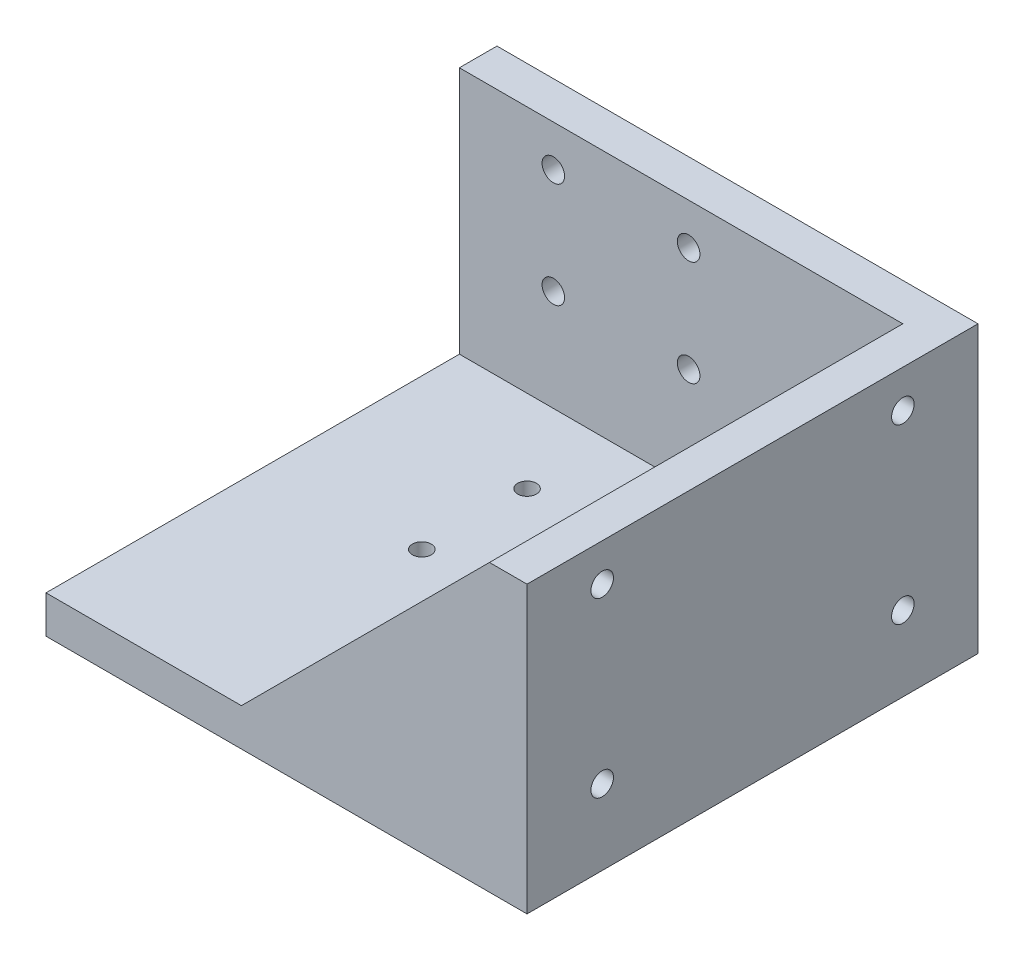
ISO-10303-21;
HEADER;
FILE_DESCRIPTION(('STEP AP214'),'2;1');
FILE_NAME('part.step','',(''),(''),'','','');
FILE_SCHEMA(('AUTOMOTIVE_DESIGN { 1 0 10303 214 1 1 1 1 }'));
ENDSEC;
DATA;
#1=APPLICATION_CONTEXT('core data for automotive mechanical design processes');
#2=APPLICATION_PROTOCOL_DEFINITION('international standard','automotive_design',2000,#1);
#3=PRODUCT_CONTEXT('',#1,'mechanical');
#4=PRODUCT('Part','Part','',(#3));
#5=PRODUCT_RELATED_PRODUCT_CATEGORY('part','',(#4));
#6=PRODUCT_DEFINITION_FORMATION('','',#4);
#7=PRODUCT_DEFINITION_CONTEXT('part definition',#1,'design');
#8=PRODUCT_DEFINITION('design','',#6,#7);
#9=PRODUCT_DEFINITION_SHAPE('','',#8);
#10=(LENGTH_UNIT() NAMED_UNIT(*) SI_UNIT(.MILLI.,.METRE.));
#11=(NAMED_UNIT(*) PLANE_ANGLE_UNIT() SI_UNIT($,.RADIAN.));
#12=(NAMED_UNIT(*) SI_UNIT($,.STERADIAN.) SOLID_ANGLE_UNIT());
#13=UNCERTAINTY_MEASURE_WITH_UNIT(LENGTH_MEASURE(1.E-05),#10,'distance_accuracy_value','');
#14=(GEOMETRIC_REPRESENTATION_CONTEXT(3) GLOBAL_UNCERTAINTY_ASSIGNED_CONTEXT((#13)) GLOBAL_UNIT_ASSIGNED_CONTEXT((#10,
#11,#12)) REPRESENTATION_CONTEXT('',''));
#15=CARTESIAN_POINT('',(0.,0.,0.));
#16=DIRECTION('',(0.,0.,1.));
#17=DIRECTION('',(1.,0.,0.));
#18=AXIS2_PLACEMENT_3D('',#15,#16,#17);
#19=CARTESIAN_POINT('',(0.,5.,0.));
#20=DIRECTION('',(0.,1.,0.));
#21=DIRECTION('',(0.,0.,1.));
#22=AXIS2_PLACEMENT_3D('',#19,#20,#21);
#23=PLANE('',#22);
#24=CARTESIAN_POINT('',(-12.,5.,-4.));
#25=DIRECTION('',(0.,1.,0.));
#26=DIRECTION('',(0.,0.,1.));
#27=AXIS2_PLACEMENT_3D('',#24,#25,#26);
#28=CIRCLE('',#27,1.25);
#29=CARTESIAN_POINT('',(-12.,5.,-2.75));
#30=VERTEX_POINT('',#29);
#31=EDGE_CURVE('E155',#30,#30,#28,.T.);
#32=ORIENTED_EDGE('',*,*,#31,.F.);
#33=EDGE_LOOP('',(#32));
#34=FACE_BOUND('',#33,.T.);
#35=CARTESIAN_POINT('',(-12.,5.,10.));
#36=DIRECTION('',(0.,1.,0.));
#37=DIRECTION('',(0.,0.,1.));
#38=AXIS2_PLACEMENT_3D('',#35,#36,#37);
#39=CIRCLE('',#38,1.25);
#40=CARTESIAN_POINT('',(-12.,5.,11.25));
#41=VERTEX_POINT('',#40);
#42=EDGE_CURVE('E161',#41,#41,#39,.T.);
#43=ORIENTED_EDGE('',*,*,#42,.F.);
#44=EDGE_LOOP('',(#43));
#45=FACE_BOUND('',#44,.T.);
#46=DIRECTION('',(0.,0.,1.));
#47=VECTOR('',#46,1.);
#48=CARTESIAN_POINT('',(-6.00000000000001,5.,35.));
#49=LINE('',#48,#47);
#50=CARTESIAN_POINT('',(-6.00000000000001,5.,35.));
#51=VERTEX_POINT('',#50);
#52=CARTESIAN_POINT('',(-6.00000000000001,5.,40.));
#53=VERTEX_POINT('',#52);
#54=EDGE_CURVE('E69',#51,#53,#49,.T.);
#55=ORIENTED_EDGE('',*,*,#54,.F.);
#56=DIRECTION('',(-1.,0.,0.));
#57=VECTOR('',#56,1.);
#58=CARTESIAN_POINT('',(-6.00000000000001,5.,35.));
#59=LINE('',#58,#57);
#60=CARTESIAN_POINT('',(27.,5.,35.));
#61=VERTEX_POINT('',#60);
#62=EDGE_CURVE('E119',#61,#51,#59,.T.);
#63=ORIENTED_EDGE('',*,*,#62,.F.);
#64=DIRECTION('',(0.,0.,-1.));
#65=VECTOR('',#64,1.);
#66=CARTESIAN_POINT('',(27.,5.,40.));
#67=LINE('',#66,#65);
#68=CARTESIAN_POINT('',(27.,5.,-15.));
#69=VERTEX_POINT('',#68);
#70=EDGE_CURVE('E132',#61,#69,#67,.T.);
#71=ORIENTED_EDGE('',*,*,#70,.T.);
#72=DIRECTION('',(1.,0.,0.));
#73=VECTOR('',#72,1.);
#74=CARTESIAN_POINT('',(-32.,5.,-15.));
#75=LINE('',#74,#73);
#76=CARTESIAN_POINT('',(-32.,5.,-15.));
#77=VERTEX_POINT('',#76);
#78=EDGE_CURVE('E173',#77,#69,#75,.T.);
#79=ORIENTED_EDGE('',*,*,#78,.F.);
#80=DIRECTION('',(0.,0.,1.));
#81=VECTOR('',#80,1.);
#82=CARTESIAN_POINT('',(-32.,5.,-20.));
#83=LINE('',#82,#81);
#84=CARTESIAN_POINT('',(-32.,4.99999999999999,40.));
#85=VERTEX_POINT('',#84);
#86=EDGE_CURVE('E147',#77,#85,#83,.T.);
#87=ORIENTED_EDGE('',*,*,#86,.T.);
#88=DIRECTION('',(-1.,0.,0.));
#89=VECTOR('',#88,1.);
#90=CARTESIAN_POINT('',(32.,5.,40.));
#91=LINE('',#90,#89);
#92=EDGE_CURVE('E214',#53,#85,#91,.T.);
#93=ORIENTED_EDGE('',*,*,#92,.F.);
#94=EDGE_LOOP('',(#55,#63,#71,#79,#87,#93));
#95=FACE_BOUND('',#94,.T.);
#96=ADVANCED_FACE('F47',(#34,#45,#95),#23,.T.);
#97=CARTESIAN_POINT('',(27.,38.,40.));
#98=DIRECTION('',(1.,0.,0.));
#99=DIRECTION('',(0.,0.,-1.));
#100=AXIS2_PLACEMENT_3D('',#97,#98,#99);
#101=PLANE('',#100);
#102=CARTESIAN_POINT('',(27.,10.,-10.));
#103=DIRECTION('',(-1.,0.,0.));
#104=DIRECTION('',(0.,0.,1.));
#105=AXIS2_PLACEMENT_3D('',#102,#103,#104);
#106=CIRCLE('',#105,1.5);
#107=CARTESIAN_POINT('',(27.,10.,-8.5));
#108=VERTEX_POINT('',#107);
#109=EDGE_CURVE('E231',#108,#108,#106,.T.);
#110=ORIENTED_EDGE('',*,*,#109,.F.);
#111=EDGE_LOOP('',(#110));
#112=FACE_BOUND('',#111,.T.);
#113=CARTESIAN_POINT('',(27.,33.,30.));
#114=DIRECTION('',(-1.,0.,0.));
#115=DIRECTION('',(0.,0.,1.));
#116=AXIS2_PLACEMENT_3D('',#113,#114,#115);
#117=CIRCLE('',#116,1.5);
#118=CARTESIAN_POINT('',(27.,33.,31.5));
#119=VERTEX_POINT('',#118);
#120=EDGE_CURVE('E238',#119,#119,#117,.T.);
#121=ORIENTED_EDGE('',*,*,#120,.F.);
#122=EDGE_LOOP('',(#121));
#123=FACE_BOUND('',#122,.T.);
#124=CARTESIAN_POINT('',(27.,10.,30.));
#125=DIRECTION('',(-1.,0.,0.));
#126=DIRECTION('',(0.,0.,1.));
#127=AXIS2_PLACEMENT_3D('',#124,#125,#126);
#128=CIRCLE('',#127,1.50000000000001);
#129=CARTESIAN_POINT('',(27.,10.,31.5));
#130=VERTEX_POINT('',#129);
#131=EDGE_CURVE('E230',#130,#130,#128,.T.);
#132=ORIENTED_EDGE('',*,*,#131,.F.);
#133=EDGE_LOOP('',(#132));
#134=FACE_BOUND('',#133,.T.);
#135=CARTESIAN_POINT('',(27.,33.,-10.));
#136=DIRECTION('',(-1.,0.,0.));
#137=DIRECTION('',(0.,0.,1.));
#138=AXIS2_PLACEMENT_3D('',#135,#136,#137);
#139=CIRCLE('',#138,1.5);
#140=CARTESIAN_POINT('',(27.,33.,-8.5));
#141=VERTEX_POINT('',#140);
#142=EDGE_CURVE('E227',#141,#141,#139,.T.);
#143=ORIENTED_EDGE('',*,*,#142,.F.);
#144=EDGE_LOOP('',(#143));
#145=FACE_BOUND('',#144,.T.);
#146=DIRECTION('',(0.,-1.,0.));
#147=VECTOR('',#146,1.);
#148=CARTESIAN_POINT('',(27.,38.,35.));
#149=LINE('',#148,#147);
#150=CARTESIAN_POINT('',(27.,38.,35.));
#151=VERTEX_POINT('',#150);
#152=EDGE_CURVE('E118',#151,#61,#149,.T.);
#153=ORIENTED_EDGE('',*,*,#152,.F.);
#154=DIRECTION('',(0.,0.,-1.));
#155=VECTOR('',#154,1.);
#156=CARTESIAN_POINT('',(27.,38.,40.));
#157=LINE('',#156,#155);
#158=CARTESIAN_POINT('',(27.,38.,-15.));
#159=VERTEX_POINT('',#158);
#160=EDGE_CURVE('E122',#151,#159,#157,.T.);
#161=ORIENTED_EDGE('',*,*,#160,.T.);
#162=DIRECTION('',(0.,-1.,0.));
#163=VECTOR('',#162,1.);
#164=CARTESIAN_POINT('',(27.,38.,-15.));
#165=LINE('',#164,#163);
#166=EDGE_CURVE('E137',#159,#69,#165,.T.);
#167=ORIENTED_EDGE('',*,*,#166,.T.);
#168=ORIENTED_EDGE('',*,*,#70,.F.);
#169=EDGE_LOOP('',(#153,#161,#167,#168));
#170=FACE_BOUND('',#169,.T.);
#171=ADVANCED_FACE('F136',(#112,#123,#134,#145,#170),#101,.F.);
#172=CARTESIAN_POINT('',(-32.,38.,-15.));
#173=DIRECTION('',(0.,0.,-1.));
#174=DIRECTION('',(-1.,0.,0.));
#175=AXIS2_PLACEMENT_3D('',#172,#173,#174);
#176=PLANE('',#175);
#177=CARTESIAN_POINT('',(-19.5,18.5,-15.));
#178=DIRECTION('',(0.,0.,-1.));
#179=DIRECTION('',(-1.,0.,0.));
#180=AXIS2_PLACEMENT_3D('',#177,#178,#179);
#181=CIRCLE('',#180,1.5);
#182=CARTESIAN_POINT('',(-21.,18.5,-15.));
#183=VERTEX_POINT('',#182);
#184=EDGE_CURVE('E177',#183,#183,#181,.F.);
#185=ORIENTED_EDGE('',*,*,#184,.F.);
#186=EDGE_LOOP('',(#185));
#187=FACE_BOUND('',#186,.T.);
#188=CARTESIAN_POINT('',(-19.5,32.5,-15.));
#189=DIRECTION('',(0.,0.,-1.));
#190=DIRECTION('',(-1.,0.,0.));
#191=AXIS2_PLACEMENT_3D('',#188,#189,#190);
#192=CIRCLE('',#191,1.5);
#193=CARTESIAN_POINT('',(-21.,32.5,-15.));
#194=VERTEX_POINT('',#193);
#195=EDGE_CURVE('E202',#194,#194,#192,.F.);
#196=ORIENTED_EDGE('',*,*,#195,.F.);
#197=EDGE_LOOP('',(#196));
#198=FACE_BOUND('',#197,.T.);
#199=CARTESIAN_POINT('',(-1.5,32.5,-15.));
#200=DIRECTION('',(0.,0.,-1.));
#201=DIRECTION('',(-1.,0.,0.));
#202=AXIS2_PLACEMENT_3D('',#199,#200,#201);
#203=CIRCLE('',#202,1.5);
#204=CARTESIAN_POINT('',(-3.,32.5,-15.));
#205=VERTEX_POINT('',#204);
#206=EDGE_CURVE('E194',#205,#205,#203,.F.);
#207=ORIENTED_EDGE('',*,*,#206,.F.);
#208=EDGE_LOOP('',(#207));
#209=FACE_BOUND('',#208,.T.);
#210=CARTESIAN_POINT('',(-1.5,18.5,-15.));
#211=DIRECTION('',(0.,0.,-1.));
#212=DIRECTION('',(-1.,0.,0.));
#213=AXIS2_PLACEMENT_3D('',#210,#211,#212);
#214=CIRCLE('',#213,1.5);
#215=CARTESIAN_POINT('',(-3.,18.5,-15.));
#216=VERTEX_POINT('',#215);
#217=EDGE_CURVE('E195',#216,#216,#214,.F.);
#218=ORIENTED_EDGE('',*,*,#217,.F.);
#219=EDGE_LOOP('',(#218));
#220=FACE_BOUND('',#219,.T.);
#221=ORIENTED_EDGE('',*,*,#166,.F.);
#222=DIRECTION('',(1.,0.,0.));
#223=VECTOR('',#222,1.);
#224=CARTESIAN_POINT('',(-32.,38.,-15.));
#225=LINE('',#224,#223);
#226=CARTESIAN_POINT('',(-32.,38.,-15.));
#227=VERTEX_POINT('',#226);
#228=EDGE_CURVE('E128',#227,#159,#225,.T.);
#229=ORIENTED_EDGE('',*,*,#228,.F.);
#230=DIRECTION('',(0.,-1.,0.));
#231=VECTOR('',#230,1.);
#232=CARTESIAN_POINT('',(-32.,38.,-15.));
#233=LINE('',#232,#231);
#234=EDGE_CURVE('E167',#227,#77,#233,.T.);
#235=ORIENTED_EDGE('',*,*,#234,.T.);
#236=ORIENTED_EDGE('',*,*,#78,.T.);
#237=EDGE_LOOP('',(#221,#229,#235,#236));
#238=FACE_BOUND('',#237,.T.);
#239=ADVANCED_FACE('F275',(#187,#198,#209,#220,#238),#176,.F.);
#240=CARTESIAN_POINT('',(0.,0.,0.));
#241=DIRECTION('',(0.,1.,0.));
#242=DIRECTION('',(0.,0.,1.));
#243=AXIS2_PLACEMENT_3D('',#240,#241,#242);
#244=PLANE('',#243);
#245=DIRECTION('',(0.,0.,-1.));
#246=VECTOR('',#245,1.);
#247=CARTESIAN_POINT('',(32.,0.,-20.));
#248=LINE('',#247,#246);
#249=CARTESIAN_POINT('',(32.,0.,40.));
#250=VERTEX_POINT('',#249);
#251=CARTESIAN_POINT('',(32.,0.,-20.));
#252=VERTEX_POINT('',#251);
#253=EDGE_CURVE('E152',#250,#252,#248,.T.);
#254=ORIENTED_EDGE('',*,*,#253,.F.);
#255=DIRECTION('',(1.,0.,0.));
#256=VECTOR('',#255,1.);
#257=CARTESIAN_POINT('',(32.,0.,40.));
#258=LINE('',#257,#256);
#259=CARTESIAN_POINT('',(-32.,0.,40.));
#260=VERTEX_POINT('',#259);
#261=EDGE_CURVE('E198',#260,#250,#258,.T.);
#262=ORIENTED_EDGE('',*,*,#261,.F.);
#263=DIRECTION('',(0.,0.,1.));
#264=VECTOR('',#263,1.);
#265=CARTESIAN_POINT('',(-32.,0.,-20.));
#266=LINE('',#265,#264);
#267=CARTESIAN_POINT('',(-32.,0.,-20.));
#268=VERTEX_POINT('',#267);
#269=EDGE_CURVE('E148',#268,#260,#266,.T.);
#270=ORIENTED_EDGE('',*,*,#269,.F.);
#271=DIRECTION('',(-1.,0.,0.));
#272=VECTOR('',#271,1.);
#273=CARTESIAN_POINT('',(-32.,0.,-20.));
#274=LINE('',#273,#272);
#275=EDGE_CURVE('E150',#252,#268,#274,.T.);
#276=ORIENTED_EDGE('',*,*,#275,.F.);
#277=EDGE_LOOP('',(#254,#262,#270,#276));
#278=FACE_BOUND('',#277,.T.);
#279=CARTESIAN_POINT('',(-12.,0.,-4.));
#280=DIRECTION('',(0.,1.,0.));
#281=DIRECTION('',(0.,0.,1.));
#282=AXIS2_PLACEMENT_3D('',#279,#280,#281);
#283=CIRCLE('',#282,1.25);
#284=CARTESIAN_POINT('',(-12.,0.,-2.75));
#285=VERTEX_POINT('',#284);
#286=EDGE_CURVE('E158',#285,#285,#283,.T.);
#287=ORIENTED_EDGE('',*,*,#286,.T.);
#288=EDGE_LOOP('',(#287));
#289=FACE_BOUND('',#288,.T.);
#290=CARTESIAN_POINT('',(-12.,0.,10.));
#291=DIRECTION('',(0.,1.,0.));
#292=DIRECTION('',(0.,0.,1.));
#293=AXIS2_PLACEMENT_3D('',#290,#291,#292);
#294=CIRCLE('',#293,1.25);
#295=CARTESIAN_POINT('',(-12.,0.,11.25));
#296=VERTEX_POINT('',#295);
#297=EDGE_CURVE('E164',#296,#296,#294,.T.);
#298=ORIENTED_EDGE('',*,*,#297,.T.);
#299=EDGE_LOOP('',(#298));
#300=FACE_BOUND('',#299,.T.);
#301=ADVANCED_FACE('F255',(#278,#289,#300),#244,.F.);
#302=CARTESIAN_POINT('',(32.,5.,-20.));
#303=DIRECTION('',(-1.,0.,0.));
#304=DIRECTION('',(0.,0.,1.));
#305=AXIS2_PLACEMENT_3D('',#302,#303,#304);
#306=PLANE('',#305);
#307=CARTESIAN_POINT('',(32.,10.,-10.));
#308=DIRECTION('',(-1.,0.,0.));
#309=DIRECTION('',(0.,0.,1.));
#310=AXIS2_PLACEMENT_3D('',#307,#308,#309);
#311=CIRCLE('',#310,1.5);
#312=CARTESIAN_POINT('',(32.,10.,-8.5));
#313=VERTEX_POINT('',#312);
#314=EDGE_CURVE('E235',#313,#313,#311,.F.);
#315=ORIENTED_EDGE('',*,*,#314,.F.);
#316=EDGE_LOOP('',(#315));
#317=FACE_BOUND('',#316,.T.);
#318=CARTESIAN_POINT('',(32.,33.,30.));
#319=DIRECTION('',(-1.,0.,0.));
#320=DIRECTION('',(0.,0.,1.));
#321=AXIS2_PLACEMENT_3D('',#318,#319,#320);
#322=CIRCLE('',#321,1.5);
#323=CARTESIAN_POINT('',(32.,33.,31.5));
#324=VERTEX_POINT('',#323);
#325=EDGE_CURVE('E234',#324,#324,#322,.F.);
#326=ORIENTED_EDGE('',*,*,#325,.F.);
#327=EDGE_LOOP('',(#326));
#328=FACE_BOUND('',#327,.T.);
#329=CARTESIAN_POINT('',(32.,10.,30.));
#330=DIRECTION('',(-1.,0.,0.));
#331=DIRECTION('',(0.,0.,1.));
#332=AXIS2_PLACEMENT_3D('',#329,#330,#331);
#333=CIRCLE('',#332,1.50000000000001);
#334=CARTESIAN_POINT('',(32.,10.,31.5));
#335=VERTEX_POINT('',#334);
#336=EDGE_CURVE('E241',#335,#335,#333,.F.);
#337=ORIENTED_EDGE('',*,*,#336,.F.);
#338=EDGE_LOOP('',(#337));
#339=FACE_BOUND('',#338,.T.);
#340=CARTESIAN_POINT('',(32.,33.,-10.));
#341=DIRECTION('',(-1.,0.,0.));
#342=DIRECTION('',(0.,0.,1.));
#343=AXIS2_PLACEMENT_3D('',#340,#341,#342);
#344=CIRCLE('',#343,1.5);
#345=CARTESIAN_POINT('',(32.,33.,-8.5));
#346=VERTEX_POINT('',#345);
#347=EDGE_CURVE('E224',#346,#346,#344,.F.);
#348=ORIENTED_EDGE('',*,*,#347,.F.);
#349=EDGE_LOOP('',(#348));
#350=FACE_BOUND('',#349,.T.);
#351=ORIENTED_EDGE('',*,*,#253,.T.);
#352=DIRECTION('',(0.,-1.,0.));
#353=VECTOR('',#352,1.);
#354=CARTESIAN_POINT('',(32.,5.,-20.));
#355=LINE('',#354,#353);
#356=CARTESIAN_POINT('',(32.,38.,-20.));
#357=VERTEX_POINT('',#356);
#358=EDGE_CURVE('E139',#357,#252,#355,.T.);
#359=ORIENTED_EDGE('',*,*,#358,.F.);
#360=DIRECTION('',(0.,0.,-1.));
#361=VECTOR('',#360,1.);
#362=CARTESIAN_POINT('',(32.,38.,-20.));
#363=LINE('',#362,#361);
#364=CARTESIAN_POINT('',(32.,38.,40.));
#365=VERTEX_POINT('',#364);
#366=EDGE_CURVE('E180',#365,#357,#363,.T.);
#367=ORIENTED_EDGE('',*,*,#366,.F.);
#368=DIRECTION('',(0.,1.,0.));
#369=VECTOR('',#368,1.);
#370=CARTESIAN_POINT('',(32.,5.,40.));
#371=LINE('',#370,#369);
#372=EDGE_CURVE('E216',#250,#365,#371,.T.);
#373=ORIENTED_EDGE('',*,*,#372,.F.);
#374=EDGE_LOOP('',(#351,#359,#367,#373));
#375=FACE_BOUND('',#374,.T.);
#376=ADVANCED_FACE('F251',(#317,#328,#339,#350,#375),#306,.F.);
#377=CARTESIAN_POINT('',(-32.,5.,-20.));
#378=DIRECTION('',(0.,0.,1.));
#379=DIRECTION('',(1.,0.,0.));
#380=AXIS2_PLACEMENT_3D('',#377,#378,#379);
#381=PLANE('',#380);
#382=CARTESIAN_POINT('',(-1.5,18.5,-20.));
#383=DIRECTION('',(0.,0.,-1.));
#384=DIRECTION('',(-1.,0.,0.));
#385=AXIS2_PLACEMENT_3D('',#382,#383,#384);
#386=CIRCLE('',#385,1.5);
#387=CARTESIAN_POINT('',(-3.,18.5,-20.));
#388=VERTEX_POINT('',#387);
#389=EDGE_CURVE('E191',#388,#388,#386,.T.);
#390=ORIENTED_EDGE('',*,*,#389,.F.);
#391=EDGE_LOOP('',(#390));
#392=FACE_BOUND('',#391,.T.);
#393=CARTESIAN_POINT('',(-1.5,32.5,-20.));
#394=DIRECTION('',(0.,0.,-1.));
#395=DIRECTION('',(-1.,0.,0.));
#396=AXIS2_PLACEMENT_3D('',#393,#394,#395);
#397=CIRCLE('',#396,1.5);
#398=CARTESIAN_POINT('',(-3.,32.5,-20.));
#399=VERTEX_POINT('',#398);
#400=EDGE_CURVE('E199',#399,#399,#397,.T.);
#401=ORIENTED_EDGE('',*,*,#400,.F.);
#402=EDGE_LOOP('',(#401));
#403=FACE_BOUND('',#402,.T.);
#404=CARTESIAN_POINT('',(-19.5,32.5,-20.));
#405=DIRECTION('',(0.,0.,-1.));
#406=DIRECTION('',(-1.,0.,0.));
#407=AXIS2_PLACEMENT_3D('',#404,#405,#406);
#408=CIRCLE('',#407,1.5);
#409=CARTESIAN_POINT('',(-21.,32.5,-20.));
#410=VERTEX_POINT('',#409);
#411=EDGE_CURVE('E190',#410,#410,#408,.T.);
#412=ORIENTED_EDGE('',*,*,#411,.F.);
#413=EDGE_LOOP('',(#412));
#414=FACE_BOUND('',#413,.T.);
#415=CARTESIAN_POINT('',(-19.5,18.5,-20.));
#416=DIRECTION('',(0.,0.,-1.));
#417=DIRECTION('',(-1.,0.,0.));
#418=AXIS2_PLACEMENT_3D('',#415,#416,#417);
#419=CIRCLE('',#418,1.5);
#420=CARTESIAN_POINT('',(-21.,18.5,-20.));
#421=VERTEX_POINT('',#420);
#422=EDGE_CURVE('E187',#421,#421,#419,.T.);
#423=ORIENTED_EDGE('',*,*,#422,.F.);
#424=EDGE_LOOP('',(#423));
#425=FACE_BOUND('',#424,.T.);
#426=ORIENTED_EDGE('',*,*,#275,.T.);
#427=DIRECTION('',(0.,-1.,0.));
#428=VECTOR('',#427,1.);
#429=CARTESIAN_POINT('',(-32.,5.,-20.));
#430=LINE('',#429,#428);
#431=CARTESIAN_POINT('',(-32.,38.,-20.));
#432=VERTEX_POINT('',#431);
#433=EDGE_CURVE('E142',#432,#268,#430,.T.);
#434=ORIENTED_EDGE('',*,*,#433,.F.);
#435=DIRECTION('',(-1.,0.,0.));
#436=VECTOR('',#435,1.);
#437=CARTESIAN_POINT('',(-32.,38.,-20.));
#438=LINE('',#437,#436);
#439=EDGE_CURVE('E172',#357,#432,#438,.T.);
#440=ORIENTED_EDGE('',*,*,#439,.F.);
#441=ORIENTED_EDGE('',*,*,#358,.T.);
#442=EDGE_LOOP('',(#426,#434,#440,#441));
#443=FACE_BOUND('',#442,.T.);
#444=ADVANCED_FACE('F254',(#392,#403,#414,#425,#443),#381,.F.);
#445=CARTESIAN_POINT('',(-32.,5.,-20.));
#446=DIRECTION('',(1.,0.,0.));
#447=DIRECTION('',(0.,0.,-1.));
#448=AXIS2_PLACEMENT_3D('',#445,#446,#447);
#449=PLANE('',#448);
#450=ORIENTED_EDGE('',*,*,#269,.T.);
#451=DIRECTION('',(0.,-1.,0.));
#452=VECTOR('',#451,1.);
#453=CARTESIAN_POINT('',(-32.,4.99999999999999,40.));
#454=LINE('',#453,#452);
#455=EDGE_CURVE('E211',#85,#260,#454,.T.);
#456=ORIENTED_EDGE('',*,*,#455,.F.);
#457=ORIENTED_EDGE('',*,*,#86,.F.);
#458=ORIENTED_EDGE('',*,*,#234,.F.);
#459=DIRECTION('',(0.,0.,1.));
#460=VECTOR('',#459,1.);
#461=CARTESIAN_POINT('',(-32.,38.,-20.));
#462=LINE('',#461,#460);
#463=EDGE_CURVE('E176',#432,#227,#462,.T.);
#464=ORIENTED_EDGE('',*,*,#463,.F.);
#465=ORIENTED_EDGE('',*,*,#433,.T.);
#466=EDGE_LOOP('',(#450,#456,#457,#458,#464,#465));
#467=FACE_BOUND('',#466,.T.);
#468=ADVANCED_FACE('F269',(#467),#449,.F.);
#469=CARTESIAN_POINT('',(-12.,5.,-4.));
#470=DIRECTION('',(0.,-1.,0.));
#471=DIRECTION('',(0.,0.,-1.));
#472=AXIS2_PLACEMENT_3D('',#469,#470,#471);
#473=CYLINDRICAL_SURFACE('',#472,1.25);
#474=ORIENTED_EDGE('',*,*,#31,.T.);
#475=EDGE_LOOP('',(#474));
#476=FACE_BOUND('',#475,.T.);
#477=ORIENTED_EDGE('',*,*,#286,.F.);
#478=EDGE_LOOP('',(#477));
#479=FACE_BOUND('',#478,.T.);
#480=ADVANCED_FACE('F300',(#476,#479),#473,.F.);
#481=CARTESIAN_POINT('',(-12.,5.,10.));
#482=DIRECTION('',(0.,-1.,0.));
#483=DIRECTION('',(0.,0.,-1.));
#484=AXIS2_PLACEMENT_3D('',#481,#482,#483);
#485=CYLINDRICAL_SURFACE('',#484,1.25);
#486=ORIENTED_EDGE('',*,*,#42,.T.);
#487=EDGE_LOOP('',(#486));
#488=FACE_BOUND('',#487,.T.);
#489=ORIENTED_EDGE('',*,*,#297,.F.);
#490=EDGE_LOOP('',(#489));
#491=FACE_BOUND('',#490,.T.);
#492=ADVANCED_FACE('F327',(#488,#491),#485,.F.);
#493=CARTESIAN_POINT('',(0.,38.,0.));
#494=DIRECTION('',(0.,1.,0.));
#495=DIRECTION('',(0.,0.,1.));
#496=AXIS2_PLACEMENT_3D('',#493,#494,#495);
#497=PLANE('',#496);
#498=ORIENTED_EDGE('',*,*,#160,.F.);
#499=DIRECTION('',(0.,0.,1.));
#500=VECTOR('',#499,1.);
#501=CARTESIAN_POINT('',(27.,38.,40.));
#502=LINE('',#501,#500);
#503=CARTESIAN_POINT('',(27.,38.,40.));
#504=VERTEX_POINT('',#503);
#505=EDGE_CURVE('E125',#151,#504,#502,.T.);
#506=ORIENTED_EDGE('',*,*,#505,.T.);
#507=DIRECTION('',(-1.,0.,0.));
#508=VECTOR('',#507,1.);
#509=CARTESIAN_POINT('',(27.,38.,40.));
#510=LINE('',#509,#508);
#511=EDGE_CURVE('E133',#365,#504,#510,.T.);
#512=ORIENTED_EDGE('',*,*,#511,.F.);
#513=ORIENTED_EDGE('',*,*,#366,.T.);
#514=ORIENTED_EDGE('',*,*,#439,.T.);
#515=ORIENTED_EDGE('',*,*,#463,.T.);
#516=ORIENTED_EDGE('',*,*,#228,.T.);
#517=EDGE_LOOP('',(#498,#506,#512,#513,#514,#515,#516));
#518=FACE_BOUND('',#517,.T.);
#519=ADVANCED_FACE('F123',(#518),#497,.T.);
#520=CARTESIAN_POINT('',(-19.5,18.5,20.001));
#521=DIRECTION('',(0.,0.,-1.));
#522=DIRECTION('',(-1.,0.,0.));
#523=AXIS2_PLACEMENT_3D('',#520,#521,#522);
#524=CYLINDRICAL_SURFACE('',#523,1.5);
#525=ORIENTED_EDGE('',*,*,#422,.T.);
#526=EDGE_LOOP('',(#525));
#527=FACE_BOUND('',#526,.T.);
#528=ORIENTED_EDGE('',*,*,#184,.T.);
#529=EDGE_LOOP('',(#528));
#530=FACE_BOUND('',#529,.T.);
#531=ADVANCED_FACE('F317',(#527,#530),#524,.F.);
#532=CARTESIAN_POINT('',(-19.5,32.5,20.001));
#533=DIRECTION('',(0.,0.,-1.));
#534=DIRECTION('',(-1.,0.,0.));
#535=AXIS2_PLACEMENT_3D('',#532,#533,#534);
#536=CYLINDRICAL_SURFACE('',#535,1.5);
#537=ORIENTED_EDGE('',*,*,#411,.T.);
#538=EDGE_LOOP('',(#537));
#539=FACE_BOUND('',#538,.T.);
#540=ORIENTED_EDGE('',*,*,#195,.T.);
#541=EDGE_LOOP('',(#540));
#542=FACE_BOUND('',#541,.T.);
#543=ADVANCED_FACE('F319',(#539,#542),#536,.F.);
#544=CARTESIAN_POINT('',(-1.5,32.5,20.001));
#545=DIRECTION('',(0.,0.,-1.));
#546=DIRECTION('',(-1.,0.,0.));
#547=AXIS2_PLACEMENT_3D('',#544,#545,#546);
#548=CYLINDRICAL_SURFACE('',#547,1.5);
#549=ORIENTED_EDGE('',*,*,#400,.T.);
#550=EDGE_LOOP('',(#549));
#551=FACE_BOUND('',#550,.T.);
#552=ORIENTED_EDGE('',*,*,#206,.T.);
#553=EDGE_LOOP('',(#552));
#554=FACE_BOUND('',#553,.T.);
#555=ADVANCED_FACE('F324',(#551,#554),#548,.F.);
#556=CARTESIAN_POINT('',(-1.5,18.5,20.001));
#557=DIRECTION('',(0.,0.,-1.));
#558=DIRECTION('',(-1.,0.,0.));
#559=AXIS2_PLACEMENT_3D('',#556,#557,#558);
#560=CYLINDRICAL_SURFACE('',#559,1.5);
#561=ORIENTED_EDGE('',*,*,#389,.T.);
#562=EDGE_LOOP('',(#561));
#563=FACE_BOUND('',#562,.T.);
#564=ORIENTED_EDGE('',*,*,#217,.T.);
#565=EDGE_LOOP('',(#564));
#566=FACE_BOUND('',#565,.T.);
#567=ADVANCED_FACE('F329',(#563,#566),#560,.F.);
#568=CARTESIAN_POINT('',(0.,0.,40.));
#569=DIRECTION('',(0.,0.,-1.));
#570=DIRECTION('',(-1.,0.,0.));
#571=AXIS2_PLACEMENT_3D('',#568,#569,#570);
#572=PLANE('',#571);
#573=ORIENTED_EDGE('',*,*,#511,.T.);
#574=DIRECTION('',(-0.707106781186546,-0.707106781186549,0.));
#575=VECTOR('',#574,1.);
#576=CARTESIAN_POINT('',(27.,38.,40.));
#577=LINE('',#576,#575);
#578=EDGE_CURVE('E56',#504,#53,#577,.T.);
#579=ORIENTED_EDGE('',*,*,#578,.T.);
#580=ORIENTED_EDGE('',*,*,#92,.T.);
#581=ORIENTED_EDGE('',*,*,#455,.T.);
#582=ORIENTED_EDGE('',*,*,#261,.T.);
#583=ORIENTED_EDGE('',*,*,#372,.T.);
#584=EDGE_LOOP('',(#573,#579,#580,#581,#582,#583));
#585=FACE_BOUND('',#584,.T.);
#586=ADVANCED_FACE('F265',(#585),#572,.F.);
#587=CARTESIAN_POINT('',(-6.00000000000001,38.,35.));
#588=DIRECTION('',(0.,0.,1.));
#589=DIRECTION('',(1.,0.,0.));
#590=AXIS2_PLACEMENT_3D('',#587,#588,#589);
#591=PLANE('',#590);
#592=ORIENTED_EDGE('',*,*,#62,.T.);
#593=DIRECTION('',(0.707106781186546,0.707106781186549,0.));
#594=VECTOR('',#593,1.);
#595=CARTESIAN_POINT('',(27.,38.,35.));
#596=LINE('',#595,#594);
#597=EDGE_CURVE('E11',#51,#151,#596,.T.);
#598=ORIENTED_EDGE('',*,*,#597,.T.);
#599=ORIENTED_EDGE('',*,*,#152,.T.);
#600=EDGE_LOOP('',(#592,#598,#599));
#601=FACE_BOUND('',#600,.T.);
#602=ADVANCED_FACE('F116',(#601),#591,.F.);
#603=CARTESIAN_POINT('',(27.,38.,0.));
#604=DIRECTION('',(-0.707106781186549,0.707106781186546,0.));
#605=DIRECTION('',(0.,0.,-1.));
#606=AXIS2_PLACEMENT_3D('',#603,#604,#605);
#607=PLANE('',#606);
#608=ORIENTED_EDGE('',*,*,#597,.F.);
#609=ORIENTED_EDGE('',*,*,#54,.T.);
#610=ORIENTED_EDGE('',*,*,#578,.F.);
#611=ORIENTED_EDGE('',*,*,#505,.F.);
#612=EDGE_LOOP('',(#608,#609,#610,#611));
#613=FACE_BOUND('',#612,.T.);
#614=ADVANCED_FACE('F50',(#613),#607,.T.);
#615=CARTESIAN_POINT('',(32.001,33.,-10.));
#616=DIRECTION('',(-1.,0.,0.));
#617=DIRECTION('',(0.,0.,1.));
#618=AXIS2_PLACEMENT_3D('',#615,#616,#617);
#619=CYLINDRICAL_SURFACE('',#618,1.5);
#620=ORIENTED_EDGE('',*,*,#142,.T.);
#621=EDGE_LOOP('',(#620));
#622=FACE_BOUND('',#621,.T.);
#623=ORIENTED_EDGE('',*,*,#347,.T.);
#624=EDGE_LOOP('',(#623));
#625=FACE_BOUND('',#624,.T.);
#626=ADVANCED_FACE('F340',(#622,#625),#619,.F.);
#627=CARTESIAN_POINT('',(32.001,10.,30.));
#628=DIRECTION('',(-1.,0.,0.));
#629=DIRECTION('',(0.,0.,1.));
#630=AXIS2_PLACEMENT_3D('',#627,#628,#629);
#631=CYLINDRICAL_SURFACE('',#630,1.50000000000001);
#632=ORIENTED_EDGE('',*,*,#131,.T.);
#633=EDGE_LOOP('',(#632));
#634=FACE_BOUND('',#633,.T.);
#635=ORIENTED_EDGE('',*,*,#336,.T.);
#636=EDGE_LOOP('',(#635));
#637=FACE_BOUND('',#636,.T.);
#638=ADVANCED_FACE('F249',(#634,#637),#631,.F.);
#639=CARTESIAN_POINT('',(32.001,33.,30.));
#640=DIRECTION('',(-1.,0.,0.));
#641=DIRECTION('',(0.,0.,1.));
#642=AXIS2_PLACEMENT_3D('',#639,#640,#641);
#643=CYLINDRICAL_SURFACE('',#642,1.5);
#644=ORIENTED_EDGE('',*,*,#120,.T.);
#645=EDGE_LOOP('',(#644));
#646=FACE_BOUND('',#645,.T.);
#647=ORIENTED_EDGE('',*,*,#325,.T.);
#648=EDGE_LOOP('',(#647));
#649=FACE_BOUND('',#648,.T.);
#650=ADVANCED_FACE('F347',(#646,#649),#643,.F.);
#651=CARTESIAN_POINT('',(32.001,10.,-10.));
#652=DIRECTION('',(-1.,0.,0.));
#653=DIRECTION('',(0.,0.,1.));
#654=AXIS2_PLACEMENT_3D('',#651,#652,#653);
#655=CYLINDRICAL_SURFACE('',#654,1.5);
#656=ORIENTED_EDGE('',*,*,#109,.T.);
#657=EDGE_LOOP('',(#656));
#658=FACE_BOUND('',#657,.T.);
#659=ORIENTED_EDGE('',*,*,#314,.T.);
#660=EDGE_LOOP('',(#659));
#661=FACE_BOUND('',#660,.T.);
#662=ADVANCED_FACE('F344',(#658,#661),#655,.F.);
#663=CLOSED_SHELL('',(#96,#171,#239,#301,#376,#444,#468,#480,#492,#519,#531,#543,#555,#567,#586,
#602,#614,#626,#638,#650,#662));
#664=MANIFOLD_SOLID_BREP('B2',#663);
#665=ADVANCED_BREP_SHAPE_REPRESENTATION('',(#18,#664),#14);
#666=SHAPE_DEFINITION_REPRESENTATION(#9,#665);
ENDSEC;
END-ISO-10303-21;
